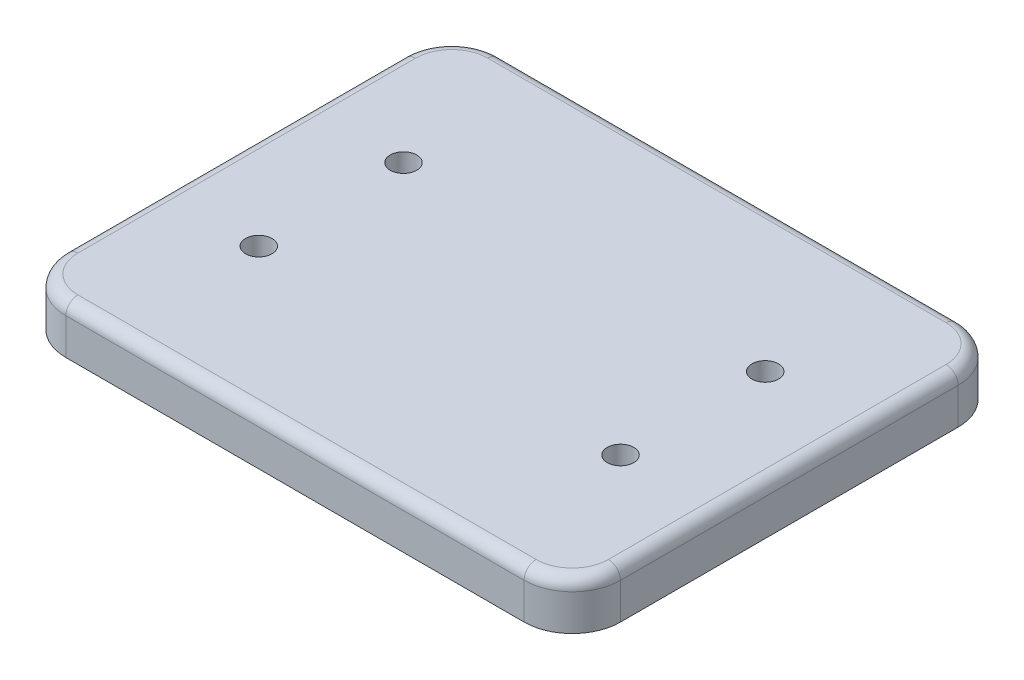
ISO-10303-21;
HEADER;
FILE_DESCRIPTION(('STEP AP214'),'2;1');
FILE_NAME('part.step','',(''),(''),'','','');
FILE_SCHEMA(('AUTOMOTIVE_DESIGN { 1 0 10303 214 1 1 1 1 }'));
ENDSEC;
DATA;
#1=APPLICATION_CONTEXT('core data for automotive mechanical design processes');
#2=APPLICATION_PROTOCOL_DEFINITION('international standard','automotive_design',2000,#1);
#3=PRODUCT_CONTEXT('',#1,'mechanical');
#4=PRODUCT('Part','Part','',(#3));
#5=PRODUCT_RELATED_PRODUCT_CATEGORY('part','',(#4));
#6=PRODUCT_DEFINITION_FORMATION('','',#4);
#7=PRODUCT_DEFINITION_CONTEXT('part definition',#1,'design');
#8=PRODUCT_DEFINITION('design','',#6,#7);
#9=PRODUCT_DEFINITION_SHAPE('','',#8);
#10=(LENGTH_UNIT() NAMED_UNIT(*) SI_UNIT(.MILLI.,.METRE.));
#11=(NAMED_UNIT(*) PLANE_ANGLE_UNIT() SI_UNIT($,.RADIAN.));
#12=(NAMED_UNIT(*) SI_UNIT($,.STERADIAN.) SOLID_ANGLE_UNIT());
#13=UNCERTAINTY_MEASURE_WITH_UNIT(LENGTH_MEASURE(1.E-05),#10,'distance_accuracy_value','');
#14=(GEOMETRIC_REPRESENTATION_CONTEXT(3) GLOBAL_UNCERTAINTY_ASSIGNED_CONTEXT((#13)) GLOBAL_UNIT_ASSIGNED_CONTEXT((#10,
#11,#12)) REPRESENTATION_CONTEXT('',''));
#15=CARTESIAN_POINT('',(0.,0.,0.));
#16=DIRECTION('',(0.,0.,1.));
#17=DIRECTION('',(1.,0.,0.));
#18=AXIS2_PLACEMENT_3D('',#15,#16,#17);
#19=CARTESIAN_POINT('',(75.,0.,30.));
#20=DIRECTION('',(0.,1.,0.));
#21=DIRECTION('',(0.,0.,1.));
#22=AXIS2_PLACEMENT_3D('',#19,#20,#21);
#23=CYLINDRICAL_SURFACE('',#22,5.5);
#24=CARTESIAN_POINT('',(75.,20.,30.));
#25=DIRECTION('',(0.,-1.,0.));
#26=DIRECTION('',(0.,0.,-1.));
#27=AXIS2_PLACEMENT_3D('',#24,#25,#26);
#28=CIRCLE('',#27,5.5);
#29=CARTESIAN_POINT('',(75.,20.,24.5));
#30=VERTEX_POINT('',#29);
#31=EDGE_CURVE('E298',#30,#30,#28,.T.);
#32=ORIENTED_EDGE('',*,*,#31,.F.);
#33=EDGE_LOOP('',(#32));
#34=FACE_BOUND('',#33,.T.);
#35=CARTESIAN_POINT('',(75.,11.,30.));
#36=DIRECTION('',(0.,-1.,0.));
#37=DIRECTION('',(0.,0.,-1.));
#38=AXIS2_PLACEMENT_3D('',#35,#36,#37);
#39=CIRCLE('',#38,5.5);
#40=CARTESIAN_POINT('',(75.,11.,24.5));
#41=VERTEX_POINT('',#40);
#42=EDGE_CURVE('E49',#41,#41,#39,.T.);
#43=ORIENTED_EDGE('',*,*,#42,.T.);
#44=EDGE_LOOP('',(#43));
#45=FACE_BOUND('',#44,.T.);
#46=ADVANCED_FACE('F45',(#34,#45),#23,.F.);
#47=CARTESIAN_POINT('',(-75.,0.,30.));
#48=DIRECTION('',(0.,1.,0.));
#49=DIRECTION('',(0.,0.,1.));
#50=AXIS2_PLACEMENT_3D('',#47,#48,#49);
#51=CYLINDRICAL_SURFACE('',#50,5.5);
#52=CARTESIAN_POINT('',(-75.,20.,30.));
#53=DIRECTION('',(0.,-1.,0.));
#54=DIRECTION('',(0.,0.,-1.));
#55=AXIS2_PLACEMENT_3D('',#52,#53,#54);
#56=CIRCLE('',#55,5.5);
#57=CARTESIAN_POINT('',(-75.,20.,24.5));
#58=VERTEX_POINT('',#57);
#59=EDGE_CURVE('E316',#58,#58,#56,.T.);
#60=ORIENTED_EDGE('',*,*,#59,.F.);
#61=EDGE_LOOP('',(#60));
#62=FACE_BOUND('',#61,.T.);
#63=CARTESIAN_POINT('',(-75.,11.,30.));
#64=DIRECTION('',(0.,-1.,0.));
#65=DIRECTION('',(0.,0.,-1.));
#66=AXIS2_PLACEMENT_3D('',#63,#64,#65);
#67=CIRCLE('',#66,5.5);
#68=CARTESIAN_POINT('',(-75.,11.,24.5));
#69=VERTEX_POINT('',#68);
#70=EDGE_CURVE('E289',#69,#69,#67,.T.);
#71=ORIENTED_EDGE('',*,*,#70,.T.);
#72=EDGE_LOOP('',(#71));
#73=FACE_BOUND('',#72,.T.);
#74=ADVANCED_FACE('F413',(#62,#73),#51,.F.);
#75=CARTESIAN_POINT('',(75.,0.,-30.));
#76=DIRECTION('',(0.,1.,0.));
#77=DIRECTION('',(0.,0.,1.));
#78=AXIS2_PLACEMENT_3D('',#75,#76,#77);
#79=CYLINDRICAL_SURFACE('',#78,5.5);
#80=CARTESIAN_POINT('',(75.,20.,-30.));
#81=DIRECTION('',(0.,1.,0.));
#82=DIRECTION('',(0.,0.,1.));
#83=AXIS2_PLACEMENT_3D('',#80,#81,#82);
#84=CIRCLE('',#83,5.5);
#85=CARTESIAN_POINT('',(75.,20.,-24.5));
#86=VERTEX_POINT('',#85);
#87=EDGE_CURVE('E168',#86,#86,#84,.T.);
#88=ORIENTED_EDGE('',*,*,#87,.T.);
#89=EDGE_LOOP('',(#88));
#90=FACE_BOUND('',#89,.T.);
#91=CARTESIAN_POINT('',(75.,11.,-30.));
#92=DIRECTION('',(0.,-1.,0.));
#93=DIRECTION('',(0.,0.,-1.));
#94=AXIS2_PLACEMENT_3D('',#91,#92,#93);
#95=CIRCLE('',#94,5.5);
#96=CARTESIAN_POINT('',(75.,11.,-35.5));
#97=VERTEX_POINT('',#96);
#98=EDGE_CURVE('E285',#97,#97,#95,.F.);
#99=ORIENTED_EDGE('',*,*,#98,.F.);
#100=EDGE_LOOP('',(#99));
#101=FACE_BOUND('',#100,.T.);
#102=ADVANCED_FACE('F345',(#90,#101),#79,.F.);
#103=CARTESIAN_POINT('',(-75.,0.,-30.));
#104=DIRECTION('',(0.,1.,0.));
#105=DIRECTION('',(0.,0.,1.));
#106=AXIS2_PLACEMENT_3D('',#103,#104,#105);
#107=CYLINDRICAL_SURFACE('',#106,5.5);
#108=CARTESIAN_POINT('',(-75.,20.,-30.));
#109=DIRECTION('',(0.,1.,0.));
#110=DIRECTION('',(0.,0.,1.));
#111=AXIS2_PLACEMENT_3D('',#108,#109,#110);
#112=CIRCLE('',#111,5.5);
#113=CARTESIAN_POINT('',(-75.,20.,-24.5));
#114=VERTEX_POINT('',#113);
#115=EDGE_CURVE('E259',#114,#114,#112,.T.);
#116=ORIENTED_EDGE('',*,*,#115,.T.);
#117=EDGE_LOOP('',(#116));
#118=FACE_BOUND('',#117,.T.);
#119=CARTESIAN_POINT('',(-75.,11.,-30.));
#120=DIRECTION('',(0.,-1.,0.));
#121=DIRECTION('',(0.,0.,-1.));
#122=AXIS2_PLACEMENT_3D('',#119,#120,#121);
#123=CIRCLE('',#122,5.5);
#124=CARTESIAN_POINT('',(-75.,11.,-35.5));
#125=VERTEX_POINT('',#124);
#126=EDGE_CURVE('E281',#125,#125,#123,.F.);
#127=ORIENTED_EDGE('',*,*,#126,.F.);
#128=EDGE_LOOP('',(#127));
#129=FACE_BOUND('',#128,.T.);
#130=ADVANCED_FACE('F442',(#118,#129),#107,.F.);
#131=CARTESIAN_POINT('',(-95.,20.,-70.));
#132=DIRECTION('',(0.,-1.,0.));
#133=DIRECTION('',(0.,0.,-1.));
#134=AXIS2_PLACEMENT_3D('',#131,#132,#133);
#135=CYLINDRICAL_SURFACE('',#134,20.);
#136=DIRECTION('',(0.,-1.,0.));
#137=VECTOR('',#136,1.);
#138=CARTESIAN_POINT('',(-115.,20.,-69.9999999999999));
#139=LINE('',#138,#137);
#140=CARTESIAN_POINT('',(-115.,15.,-69.9999999999999));
#141=VERTEX_POINT('',#140);
#142=CARTESIAN_POINT('',(-115.,0.,-69.9999999999999));
#143=VERTEX_POINT('',#142);
#144=EDGE_CURVE('E134',#141,#143,#139,.T.);
#145=ORIENTED_EDGE('',*,*,#144,.F.);
#146=CARTESIAN_POINT('',(-95.,15.,-70.));
#147=DIRECTION('',(0.,1.,0.));
#148=DIRECTION('',(0.,0.,1.));
#149=AXIS2_PLACEMENT_3D('',#146,#147,#148);
#150=CIRCLE('',#149,20.);
#151=CARTESIAN_POINT('',(-94.9999999999998,15.,-90.));
#152=VERTEX_POINT('',#151);
#153=EDGE_CURVE('E11',#141,#152,#150,.F.);
#154=ORIENTED_EDGE('',*,*,#153,.T.);
#155=DIRECTION('',(0.,-1.,0.));
#156=VECTOR('',#155,1.);
#157=CARTESIAN_POINT('',(-94.9999999999998,20.,-90.));
#158=LINE('',#157,#156);
#159=CARTESIAN_POINT('',(-94.9999999999998,0.,-90.));
#160=VERTEX_POINT('',#159);
#161=EDGE_CURVE('E158',#152,#160,#158,.T.);
#162=ORIENTED_EDGE('',*,*,#161,.T.);
#163=CARTESIAN_POINT('',(-95.,0.,-70.));
#164=DIRECTION('',(0.,1.,0.));
#165=DIRECTION('',(0.,0.,1.));
#166=AXIS2_PLACEMENT_3D('',#163,#164,#165);
#167=CIRCLE('',#166,20.);
#168=EDGE_CURVE('E150',#160,#143,#167,.T.);
#169=ORIENTED_EDGE('',*,*,#168,.T.);
#170=EDGE_LOOP('',(#145,#154,#162,#169));
#171=FACE_BOUND('',#170,.T.);
#172=ADVANCED_FACE('F156',(#171),#135,.T.);
#173=CARTESIAN_POINT('',(-115.,20.,-69.9999999999999));
#174=DIRECTION('',(1.,0.,0.));
#175=DIRECTION('',(0.,0.,-1.));
#176=AXIS2_PLACEMENT_3D('',#173,#174,#175);
#177=PLANE('',#176);
#178=DIRECTION('',(0.,-1.,0.));
#179=VECTOR('',#178,1.);
#180=CARTESIAN_POINT('',(-115.,20.,69.9999999999998));
#181=LINE('',#180,#179);
#182=CARTESIAN_POINT('',(-115.,15.,69.9999999999998));
#183=VERTEX_POINT('',#182);
#184=CARTESIAN_POINT('',(-115.,0.,69.9999999999998));
#185=VERTEX_POINT('',#184);
#186=EDGE_CURVE('E144',#183,#185,#181,.T.);
#187=ORIENTED_EDGE('',*,*,#186,.F.);
#188=DIRECTION('',(0.,0.,1.));
#189=VECTOR('',#188,1.);
#190=CARTESIAN_POINT('',(-115.,15.,-69.9999999999999));
#191=LINE('',#190,#189);
#192=EDGE_CURVE('E55',#183,#141,#191,.F.);
#193=ORIENTED_EDGE('',*,*,#192,.T.);
#194=ORIENTED_EDGE('',*,*,#144,.T.);
#195=DIRECTION('',(0.,0.,1.));
#196=VECTOR('',#195,1.);
#197=CARTESIAN_POINT('',(-115.,0.,-69.9999999999999));
#198=LINE('',#197,#196);
#199=EDGE_CURVE('E137',#143,#185,#198,.T.);
#200=ORIENTED_EDGE('',*,*,#199,.T.);
#201=EDGE_LOOP('',(#187,#193,#194,#200));
#202=FACE_BOUND('',#201,.T.);
#203=ADVANCED_FACE('F136',(#202),#177,.F.);
#204=CARTESIAN_POINT('',(-95.,20.,70.));
#205=DIRECTION('',(0.,-1.,0.));
#206=DIRECTION('',(0.,0.,-1.));
#207=AXIS2_PLACEMENT_3D('',#204,#205,#206);
#208=CYLINDRICAL_SURFACE('',#207,20.);
#209=DIRECTION('',(0.,-1.,0.));
#210=VECTOR('',#209,1.);
#211=CARTESIAN_POINT('',(-94.9999999999998,20.,90.));
#212=LINE('',#211,#210);
#213=CARTESIAN_POINT('',(-94.9999999999998,15.,90.));
#214=VERTEX_POINT('',#213);
#215=CARTESIAN_POINT('',(-94.9999999999998,0.,90.));
#216=VERTEX_POINT('',#215);
#217=EDGE_CURVE('E206',#214,#216,#212,.T.);
#218=ORIENTED_EDGE('',*,*,#217,.F.);
#219=CARTESIAN_POINT('',(-95.,15.,70.));
#220=DIRECTION('',(0.,1.,0.));
#221=DIRECTION('',(0.,0.,1.));
#222=AXIS2_PLACEMENT_3D('',#219,#220,#221);
#223=CIRCLE('',#222,20.);
#224=EDGE_CURVE('E70',#214,#183,#223,.F.);
#225=ORIENTED_EDGE('',*,*,#224,.T.);
#226=ORIENTED_EDGE('',*,*,#186,.T.);
#227=CARTESIAN_POINT('',(-95.,0.,70.));
#228=DIRECTION('',(0.,1.,0.));
#229=DIRECTION('',(0.,0.,-1.));
#230=AXIS2_PLACEMENT_3D('',#227,#228,#229);
#231=CIRCLE('',#230,20.);
#232=EDGE_CURVE('E153',#185,#216,#231,.T.);
#233=ORIENTED_EDGE('',*,*,#232,.T.);
#234=EDGE_LOOP('',(#218,#225,#226,#233));
#235=FACE_BOUND('',#234,.T.);
#236=ADVANCED_FACE('F663',(#235),#208,.T.);
#237=CARTESIAN_POINT('',(94.9999999999999,20.,90.));
#238=DIRECTION('',(0.,0.,-1.));
#239=DIRECTION('',(-1.,0.,0.));
#240=AXIS2_PLACEMENT_3D('',#237,#238,#239);
#241=PLANE('',#240);
#242=DIRECTION('',(0.,-1.,0.));
#243=VECTOR('',#242,1.);
#244=CARTESIAN_POINT('',(94.9999999999999,20.,90.));
#245=LINE('',#244,#243);
#246=CARTESIAN_POINT('',(94.9999999999999,15.,90.));
#247=VERTEX_POINT('',#246);
#248=CARTESIAN_POINT('',(94.9999999999999,0.,90.));
#249=VERTEX_POINT('',#248);
#250=EDGE_CURVE('E203',#247,#249,#245,.T.);
#251=ORIENTED_EDGE('',*,*,#250,.F.);
#252=DIRECTION('',(1.,0.,0.));
#253=VECTOR('',#252,1.);
#254=CARTESIAN_POINT('',(-94.9999999999998,15.,90.));
#255=LINE('',#254,#253);
#256=EDGE_CURVE('E248',#247,#214,#255,.F.);
#257=ORIENTED_EDGE('',*,*,#256,.T.);
#258=ORIENTED_EDGE('',*,*,#217,.T.);
#259=DIRECTION('',(1.,0.,0.));
#260=VECTOR('',#259,1.);
#261=CARTESIAN_POINT('',(94.9999999999999,0.,90.));
#262=LINE('',#261,#260);
#263=EDGE_CURVE('E173',#216,#249,#262,.T.);
#264=ORIENTED_EDGE('',*,*,#263,.T.);
#265=EDGE_LOOP('',(#251,#257,#258,#264));
#266=FACE_BOUND('',#265,.T.);
#267=ADVANCED_FACE('F654',(#266),#241,.F.);
#268=CARTESIAN_POINT('',(95.,20.,70.));
#269=DIRECTION('',(0.,-1.,0.));
#270=DIRECTION('',(0.,0.,-1.));
#271=AXIS2_PLACEMENT_3D('',#268,#269,#270);
#272=CYLINDRICAL_SURFACE('',#271,20.);
#273=DIRECTION('',(0.,-1.,0.));
#274=VECTOR('',#273,1.);
#275=CARTESIAN_POINT('',(115.,20.,69.9999999999998));
#276=LINE('',#275,#274);
#277=CARTESIAN_POINT('',(115.,15.,69.9999999999998));
#278=VERTEX_POINT('',#277);
#279=CARTESIAN_POINT('',(115.,0.,69.9999999999998));
#280=VERTEX_POINT('',#279);
#281=EDGE_CURVE('E200',#278,#280,#276,.T.);
#282=ORIENTED_EDGE('',*,*,#281,.F.);
#283=CARTESIAN_POINT('',(95.,15.,70.));
#284=DIRECTION('',(0.,1.,0.));
#285=DIRECTION('',(0.,0.,1.));
#286=AXIS2_PLACEMENT_3D('',#283,#284,#285);
#287=CIRCLE('',#286,20.);
#288=EDGE_CURVE('E245',#278,#247,#287,.F.);
#289=ORIENTED_EDGE('',*,*,#288,.T.);
#290=ORIENTED_EDGE('',*,*,#250,.T.);
#291=CARTESIAN_POINT('',(95.,0.,70.));
#292=DIRECTION('',(0.,1.,0.));
#293=DIRECTION('',(0.,0.,-1.));
#294=AXIS2_PLACEMENT_3D('',#291,#292,#293);
#295=CIRCLE('',#294,20.);
#296=EDGE_CURVE('E177',#249,#280,#295,.T.);
#297=ORIENTED_EDGE('',*,*,#296,.T.);
#298=EDGE_LOOP('',(#282,#289,#290,#297));
#299=FACE_BOUND('',#298,.T.);
#300=ADVANCED_FACE('F395',(#299),#272,.T.);
#301=CARTESIAN_POINT('',(115.,20.,-69.9999999999999));
#302=DIRECTION('',(-1.,0.,0.));
#303=DIRECTION('',(0.,0.,1.));
#304=AXIS2_PLACEMENT_3D('',#301,#302,#303);
#305=PLANE('',#304);
#306=DIRECTION('',(0.,-1.,0.));
#307=VECTOR('',#306,1.);
#308=CARTESIAN_POINT('',(115.,20.,-69.9999999999999));
#309=LINE('',#308,#307);
#310=CARTESIAN_POINT('',(115.,15.,-69.9999999999999));
#311=VERTEX_POINT('',#310);
#312=CARTESIAN_POINT('',(115.,0.,-69.9999999999999));
#313=VERTEX_POINT('',#312);
#314=EDGE_CURVE('E197',#311,#313,#309,.T.);
#315=ORIENTED_EDGE('',*,*,#314,.F.);
#316=DIRECTION('',(0.,0.,-1.));
#317=VECTOR('',#316,1.);
#318=CARTESIAN_POINT('',(115.,15.,69.9999999999998));
#319=LINE('',#318,#317);
#320=EDGE_CURVE('E242',#311,#278,#319,.F.);
#321=ORIENTED_EDGE('',*,*,#320,.T.);
#322=ORIENTED_EDGE('',*,*,#281,.T.);
#323=DIRECTION('',(0.,0.,-1.));
#324=VECTOR('',#323,1.);
#325=CARTESIAN_POINT('',(115.,0.,-69.9999999999999));
#326=LINE('',#325,#324);
#327=EDGE_CURVE('E181',#280,#313,#326,.T.);
#328=ORIENTED_EDGE('',*,*,#327,.T.);
#329=EDGE_LOOP('',(#315,#321,#322,#328));
#330=FACE_BOUND('',#329,.T.);
#331=ADVANCED_FACE('F393',(#330),#305,.F.);
#332=CARTESIAN_POINT('',(95.,20.,-70.));
#333=DIRECTION('',(0.,-1.,0.));
#334=DIRECTION('',(0.,0.,-1.));
#335=AXIS2_PLACEMENT_3D('',#332,#333,#334);
#336=CYLINDRICAL_SURFACE('',#335,20.);
#337=DIRECTION('',(0.,-1.,0.));
#338=VECTOR('',#337,1.);
#339=CARTESIAN_POINT('',(94.9999999999999,20.,-90.));
#340=LINE('',#339,#338);
#341=CARTESIAN_POINT('',(94.9999999999999,15.,-90.));
#342=VERTEX_POINT('',#341);
#343=CARTESIAN_POINT('',(94.9999999999999,0.,-90.));
#344=VERTEX_POINT('',#343);
#345=EDGE_CURVE('E194',#342,#344,#340,.T.);
#346=ORIENTED_EDGE('',*,*,#345,.F.);
#347=CARTESIAN_POINT('',(95.,15.,-70.));
#348=DIRECTION('',(0.,1.,0.));
#349=DIRECTION('',(0.,0.,1.));
#350=AXIS2_PLACEMENT_3D('',#347,#348,#349);
#351=CIRCLE('',#350,20.);
#352=EDGE_CURVE('E239',#342,#311,#351,.F.);
#353=ORIENTED_EDGE('',*,*,#352,.T.);
#354=ORIENTED_EDGE('',*,*,#314,.T.);
#355=CARTESIAN_POINT('',(95.,0.,-70.));
#356=DIRECTION('',(0.,1.,0.));
#357=DIRECTION('',(0.,0.,-1.));
#358=AXIS2_PLACEMENT_3D('',#355,#356,#357);
#359=CIRCLE('',#358,20.);
#360=EDGE_CURVE('E185',#313,#344,#359,.T.);
#361=ORIENTED_EDGE('',*,*,#360,.T.);
#362=EDGE_LOOP('',(#346,#353,#354,#361));
#363=FACE_BOUND('',#362,.T.);
#364=ADVANCED_FACE('F402',(#363),#336,.T.);
#365=CARTESIAN_POINT('',(94.9999999999999,20.,-90.));
#366=DIRECTION('',(0.,0.,1.));
#367=DIRECTION('',(1.,0.,0.));
#368=AXIS2_PLACEMENT_3D('',#365,#366,#367);
#369=PLANE('',#368);
#370=ORIENTED_EDGE('',*,*,#161,.F.);
#371=DIRECTION('',(-1.,0.,0.));
#372=VECTOR('',#371,1.);
#373=CARTESIAN_POINT('',(94.9999999999999,15.,-90.));
#374=LINE('',#373,#372);
#375=EDGE_CURVE('E235',#152,#342,#374,.F.);
#376=ORIENTED_EDGE('',*,*,#375,.T.);
#377=ORIENTED_EDGE('',*,*,#345,.T.);
#378=DIRECTION('',(-1.,0.,0.));
#379=VECTOR('',#378,1.);
#380=CARTESIAN_POINT('',(94.9999999999999,0.,-90.));
#381=LINE('',#380,#379);
#382=EDGE_CURVE('E189',#344,#160,#381,.T.);
#383=ORIENTED_EDGE('',*,*,#382,.T.);
#384=EDGE_LOOP('',(#370,#376,#377,#383));
#385=FACE_BOUND('',#384,.T.);
#386=ADVANCED_FACE('F351',(#385),#369,.F.);
#387=CARTESIAN_POINT('',(-95.,20.,-70.));
#388=DIRECTION('',(0.,1.,0.));
#389=DIRECTION('',(0.,0.,1.));
#390=AXIS2_PLACEMENT_3D('',#387,#388,#389);
#391=PLANE('',#390);
#392=ORIENTED_EDGE('',*,*,#59,.T.);
#393=EDGE_LOOP('',(#392));
#394=FACE_BOUND('',#393,.T.);
#395=ORIENTED_EDGE('',*,*,#31,.T.);
#396=EDGE_LOOP('',(#395));
#397=FACE_BOUND('',#396,.T.);
#398=ORIENTED_EDGE('',*,*,#115,.F.);
#399=EDGE_LOOP('',(#398));
#400=FACE_BOUND('',#399,.T.);
#401=ORIENTED_EDGE('',*,*,#87,.F.);
#402=EDGE_LOOP('',(#401));
#403=FACE_BOUND('',#402,.T.);
#404=CARTESIAN_POINT('',(95.,20.,-70.));
#405=DIRECTION('',(0.,1.,0.));
#406=DIRECTION('',(0.,0.,1.));
#407=AXIS2_PLACEMENT_3D('',#404,#405,#406);
#408=CIRCLE('',#407,15.);
#409=CARTESIAN_POINT('',(110.,20.,-69.9999999999999));
#410=VERTEX_POINT('',#409);
#411=CARTESIAN_POINT('',(94.9999999999999,20.,-85.));
#412=VERTEX_POINT('',#411);
#413=EDGE_CURVE('E228',#410,#412,#408,.T.);
#414=ORIENTED_EDGE('',*,*,#413,.T.);
#415=DIRECTION('',(-1.,0.,0.));
#416=VECTOR('',#415,1.);
#417=CARTESIAN_POINT('',(-94.9999999999998,20.,-85.));
#418=LINE('',#417,#416);
#419=CARTESIAN_POINT('',(-94.9999999999998,20.,-85.));
#420=VERTEX_POINT('',#419);
#421=EDGE_CURVE('E231',#412,#420,#418,.T.);
#422=ORIENTED_EDGE('',*,*,#421,.T.);
#423=CARTESIAN_POINT('',(-95.,20.,-70.));
#424=DIRECTION('',(0.,1.,0.));
#425=DIRECTION('',(0.,0.,1.));
#426=AXIS2_PLACEMENT_3D('',#423,#424,#425);
#427=CIRCLE('',#426,15.);
#428=CARTESIAN_POINT('',(-110.,20.,-69.9999999999999));
#429=VERTEX_POINT('',#428);
#430=EDGE_CURVE('E143',#420,#429,#427,.T.);
#431=ORIENTED_EDGE('',*,*,#430,.T.);
#432=DIRECTION('',(0.,0.,1.));
#433=VECTOR('',#432,1.);
#434=CARTESIAN_POINT('',(-110.,20.,69.9999999999998));
#435=LINE('',#434,#433);
#436=CARTESIAN_POINT('',(-110.,20.,69.9999999999999));
#437=VERTEX_POINT('',#436);
#438=EDGE_CURVE('E213',#429,#437,#435,.T.);
#439=ORIENTED_EDGE('',*,*,#438,.T.);
#440=CARTESIAN_POINT('',(-95.,20.,70.));
#441=DIRECTION('',(0.,1.,0.));
#442=DIRECTION('',(0.,0.,1.));
#443=AXIS2_PLACEMENT_3D('',#440,#441,#442);
#444=CIRCLE('',#443,15.);
#445=CARTESIAN_POINT('',(-94.9999999999998,20.,85.));
#446=VERTEX_POINT('',#445);
#447=EDGE_CURVE('E216',#437,#446,#444,.T.);
#448=ORIENTED_EDGE('',*,*,#447,.T.);
#449=DIRECTION('',(1.,0.,0.));
#450=VECTOR('',#449,1.);
#451=CARTESIAN_POINT('',(94.9999999999999,20.,85.));
#452=LINE('',#451,#450);
#453=CARTESIAN_POINT('',(94.9999999999999,20.,85.));
#454=VERTEX_POINT('',#453);
#455=EDGE_CURVE('E219',#446,#454,#452,.T.);
#456=ORIENTED_EDGE('',*,*,#455,.T.);
#457=CARTESIAN_POINT('',(95.,20.,70.));
#458=DIRECTION('',(0.,1.,0.));
#459=DIRECTION('',(0.,0.,1.));
#460=AXIS2_PLACEMENT_3D('',#457,#458,#459);
#461=CIRCLE('',#460,15.);
#462=CARTESIAN_POINT('',(110.,20.,69.9999999999998));
#463=VERTEX_POINT('',#462);
#464=EDGE_CURVE('E222',#454,#463,#461,.T.);
#465=ORIENTED_EDGE('',*,*,#464,.T.);
#466=DIRECTION('',(0.,0.,-1.));
#467=VECTOR('',#466,1.);
#468=CARTESIAN_POINT('',(110.,20.,-69.9999999999999));
#469=LINE('',#468,#467);
#470=EDGE_CURVE('E225',#463,#410,#469,.T.);
#471=ORIENTED_EDGE('',*,*,#470,.T.);
#472=EDGE_LOOP('',(#414,#422,#431,#439,#448,#456,#465,#471));
#473=FACE_BOUND('',#472,.T.);
#474=ADVANCED_FACE('F348',(#394,#397,#400,#403,#473),#391,.T.);
#475=CARTESIAN_POINT('',(-95.,0.,-70.));
#476=DIRECTION('',(0.,1.,0.));
#477=DIRECTION('',(0.,0.,1.));
#478=AXIS2_PLACEMENT_3D('',#475,#476,#477);
#479=PLANE('',#478);
#480=CARTESIAN_POINT('',(-75.,0.,30.));
#481=DIRECTION('',(0.,1.,0.));
#482=DIRECTION('',(0.,0.,1.));
#483=AXIS2_PLACEMENT_3D('',#480,#481,#482);
#484=CIRCLE('',#483,9.);
#485=CARTESIAN_POINT('',(-75.,0.,39.));
#486=VERTEX_POINT('',#485);
#487=EDGE_CURVE('E300',#486,#486,#484,.T.);
#488=ORIENTED_EDGE('',*,*,#487,.T.);
#489=EDGE_LOOP('',(#488));
#490=FACE_BOUND('',#489,.T.);
#491=CARTESIAN_POINT('',(75.,0.,30.));
#492=DIRECTION('',(0.,1.,0.));
#493=DIRECTION('',(0.,0.,1.));
#494=AXIS2_PLACEMENT_3D('',#491,#492,#493);
#495=CIRCLE('',#494,9.);
#496=CARTESIAN_POINT('',(75.,0.,39.));
#497=VERTEX_POINT('',#496);
#498=EDGE_CURVE('E312',#497,#497,#495,.T.);
#499=ORIENTED_EDGE('',*,*,#498,.T.);
#500=EDGE_LOOP('',(#499));
#501=FACE_BOUND('',#500,.T.);
#502=CARTESIAN_POINT('',(-75.,0.,-30.));
#503=DIRECTION('',(0.,-1.,0.));
#504=DIRECTION('',(0.,0.,-1.));
#505=AXIS2_PLACEMENT_3D('',#502,#503,#504);
#506=CIRCLE('',#505,9.);
#507=CARTESIAN_POINT('',(-75.,0.,-39.));
#508=VERTEX_POINT('',#507);
#509=EDGE_CURVE('E327',#508,#508,#506,.T.);
#510=ORIENTED_EDGE('',*,*,#509,.F.);
#511=EDGE_LOOP('',(#510));
#512=FACE_BOUND('',#511,.T.);
#513=CARTESIAN_POINT('',(75.,0.,-30.));
#514=DIRECTION('',(0.,-1.,0.));
#515=DIRECTION('',(0.,0.,-1.));
#516=AXIS2_PLACEMENT_3D('',#513,#514,#515);
#517=CIRCLE('',#516,9.);
#518=CARTESIAN_POINT('',(75.,0.,-39.));
#519=VERTEX_POINT('',#518);
#520=EDGE_CURVE('E331',#519,#519,#517,.T.);
#521=ORIENTED_EDGE('',*,*,#520,.F.);
#522=EDGE_LOOP('',(#521));
#523=FACE_BOUND('',#522,.T.);
#524=ORIENTED_EDGE('',*,*,#168,.F.);
#525=ORIENTED_EDGE('',*,*,#382,.F.);
#526=ORIENTED_EDGE('',*,*,#360,.F.);
#527=ORIENTED_EDGE('',*,*,#327,.F.);
#528=ORIENTED_EDGE('',*,*,#296,.F.);
#529=ORIENTED_EDGE('',*,*,#263,.F.);
#530=ORIENTED_EDGE('',*,*,#232,.F.);
#531=ORIENTED_EDGE('',*,*,#199,.F.);
#532=EDGE_LOOP('',(#524,#525,#526,#527,#528,#529,#530,#531));
#533=FACE_BOUND('',#532,.T.);
#534=ADVANCED_FACE('F148',(#490,#501,#512,#523,#533),#479,.F.);
#535=CARTESIAN_POINT('',(-95.,15.,85.));
#536=DIRECTION('',(-1.,0.,0.));
#537=DIRECTION('',(0.,0.,1.));
#538=AXIS2_PLACEMENT_3D('',#535,#536,#537);
#539=CYLINDRICAL_SURFACE('',#538,5.);
#540=CARTESIAN_POINT('',(-94.9999999999998,15.,85.));
#541=DIRECTION('',(-1.,0.,0.));
#542=DIRECTION('',(0.,0.,1.));
#543=AXIS2_PLACEMENT_3D('',#540,#541,#542);
#544=CIRCLE('',#543,5.);
#545=EDGE_CURVE('E165',#214,#446,#544,.T.);
#546=ORIENTED_EDGE('',*,*,#545,.F.);
#547=ORIENTED_EDGE('',*,*,#256,.F.);
#548=CARTESIAN_POINT('',(94.9999999999999,15.,85.));
#549=DIRECTION('',(1.,0.,0.));
#550=DIRECTION('',(0.,0.,-1.));
#551=AXIS2_PLACEMENT_3D('',#548,#549,#550);
#552=CIRCLE('',#551,5.);
#553=EDGE_CURVE('E161',#454,#247,#552,.T.);
#554=ORIENTED_EDGE('',*,*,#553,.F.);
#555=ORIENTED_EDGE('',*,*,#455,.F.);
#556=EDGE_LOOP('',(#546,#547,#554,#555));
#557=FACE_BOUND('',#556,.T.);
#558=ADVANCED_FACE('F47',(#557),#539,.T.);
#559=CARTESIAN_POINT('',(95.,15.,70.));
#560=DIRECTION('',(0.,1.,0.));
#561=DIRECTION('',(0.,0.,1.));
#562=AXIS2_PLACEMENT_3D('',#559,#560,#561);
#563=TOROIDAL_SURFACE('',#562,15.,5.);
#564=ORIENTED_EDGE('',*,*,#553,.T.);
#565=ORIENTED_EDGE('',*,*,#288,.F.);
#566=CARTESIAN_POINT('',(110.,15.,69.9999999999998));
#567=DIRECTION('',(0.,0.,-1.));
#568=DIRECTION('',(-1.,0.,0.));
#569=AXIS2_PLACEMENT_3D('',#566,#567,#568);
#570=CIRCLE('',#569,5.);
#571=EDGE_CURVE('E274',#463,#278,#570,.T.);
#572=ORIENTED_EDGE('',*,*,#571,.F.);
#573=ORIENTED_EDGE('',*,*,#464,.F.);
#574=EDGE_LOOP('',(#564,#565,#572,#573));
#575=FACE_BOUND('',#574,.T.);
#576=ADVANCED_FACE('F386',(#575),#563,.T.);
#577=CARTESIAN_POINT('',(-95.,15.,70.));
#578=DIRECTION('',(0.,1.,0.));
#579=DIRECTION('',(0.,0.,1.));
#580=AXIS2_PLACEMENT_3D('',#577,#578,#579);
#581=TOROIDAL_SURFACE('',#580,15.,5.);
#582=ORIENTED_EDGE('',*,*,#545,.T.);
#583=ORIENTED_EDGE('',*,*,#447,.F.);
#584=CARTESIAN_POINT('',(-110.,15.,69.9999999999999));
#585=DIRECTION('',(0.,0.,-1.));
#586=DIRECTION('',(-1.,0.,0.));
#587=AXIS2_PLACEMENT_3D('',#584,#585,#586);
#588=CIRCLE('',#587,5.);
#589=EDGE_CURVE('E270',#183,#437,#588,.T.);
#590=ORIENTED_EDGE('',*,*,#589,.F.);
#591=ORIENTED_EDGE('',*,*,#224,.F.);
#592=EDGE_LOOP('',(#582,#583,#590,#591));
#593=FACE_BOUND('',#592,.T.);
#594=ADVANCED_FACE('F376',(#593),#581,.T.);
#595=CARTESIAN_POINT('',(110.,15.,-70.0000000000001));
#596=DIRECTION('',(0.,0.,1.));
#597=DIRECTION('',(1.,0.,0.));
#598=AXIS2_PLACEMENT_3D('',#595,#596,#597);
#599=CYLINDRICAL_SURFACE('',#598,5.);
#600=ORIENTED_EDGE('',*,*,#571,.T.);
#601=ORIENTED_EDGE('',*,*,#320,.F.);
#602=CARTESIAN_POINT('',(110.,15.,-69.9999999999999));
#603=DIRECTION('',(0.,0.,-1.));
#604=DIRECTION('',(-1.,0.,0.));
#605=AXIS2_PLACEMENT_3D('',#602,#603,#604);
#606=CIRCLE('',#605,5.);
#607=EDGE_CURVE('E266',#410,#311,#606,.T.);
#608=ORIENTED_EDGE('',*,*,#607,.F.);
#609=ORIENTED_EDGE('',*,*,#470,.F.);
#610=EDGE_LOOP('',(#600,#601,#608,#609));
#611=FACE_BOUND('',#610,.T.);
#612=ADVANCED_FACE('F389',(#611),#599,.T.);
#613=CARTESIAN_POINT('',(-110.,15.,-70.));
#614=DIRECTION('',(0.,0.,-1.));
#615=DIRECTION('',(-1.,0.,0.));
#616=AXIS2_PLACEMENT_3D('',#613,#614,#615);
#617=CYLINDRICAL_SURFACE('',#616,5.);
#618=ORIENTED_EDGE('',*,*,#589,.T.);
#619=ORIENTED_EDGE('',*,*,#438,.F.);
#620=CARTESIAN_POINT('',(-110.,15.,-69.9999999999999));
#621=DIRECTION('',(0.,0.,-1.));
#622=DIRECTION('',(-1.,0.,0.));
#623=AXIS2_PLACEMENT_3D('',#620,#621,#622);
#624=CIRCLE('',#623,5.);
#625=EDGE_CURVE('E262',#141,#429,#624,.T.);
#626=ORIENTED_EDGE('',*,*,#625,.F.);
#627=ORIENTED_EDGE('',*,*,#192,.F.);
#628=EDGE_LOOP('',(#618,#619,#626,#627));
#629=FACE_BOUND('',#628,.T.);
#630=ADVANCED_FACE('F373',(#629),#617,.T.);
#631=CARTESIAN_POINT('',(95.,15.,-70.));
#632=DIRECTION('',(0.,1.,0.));
#633=DIRECTION('',(0.,0.,1.));
#634=AXIS2_PLACEMENT_3D('',#631,#632,#633);
#635=TOROIDAL_SURFACE('',#634,15.,5.);
#636=ORIENTED_EDGE('',*,*,#607,.T.);
#637=ORIENTED_EDGE('',*,*,#352,.F.);
#638=CARTESIAN_POINT('',(94.9999999999999,15.,-85.));
#639=DIRECTION('',(-1.,0.,0.));
#640=DIRECTION('',(0.,0.,1.));
#641=AXIS2_PLACEMENT_3D('',#638,#639,#640);
#642=CIRCLE('',#641,5.);
#643=EDGE_CURVE('E258',#412,#342,#642,.T.);
#644=ORIENTED_EDGE('',*,*,#643,.F.);
#645=ORIENTED_EDGE('',*,*,#413,.F.);
#646=EDGE_LOOP('',(#636,#637,#644,#645));
#647=FACE_BOUND('',#646,.T.);
#648=ADVANCED_FACE('F361',(#647),#635,.T.);
#649=CARTESIAN_POINT('',(-95.,15.,-70.));
#650=DIRECTION('',(0.,1.,0.));
#651=DIRECTION('',(0.,0.,1.));
#652=AXIS2_PLACEMENT_3D('',#649,#650,#651);
#653=TOROIDAL_SURFACE('',#652,15.,5.);
#654=ORIENTED_EDGE('',*,*,#625,.T.);
#655=ORIENTED_EDGE('',*,*,#430,.F.);
#656=CARTESIAN_POINT('',(-94.9999999999999,15.,-85.));
#657=DIRECTION('',(1.,0.,0.));
#658=DIRECTION('',(0.,0.,-1.));
#659=AXIS2_PLACEMENT_3D('',#656,#657,#658);
#660=CIRCLE('',#659,5.);
#661=EDGE_CURVE('E255',#152,#420,#660,.T.);
#662=ORIENTED_EDGE('',*,*,#661,.F.);
#663=ORIENTED_EDGE('',*,*,#153,.F.);
#664=EDGE_LOOP('',(#654,#655,#662,#663));
#665=FACE_BOUND('',#664,.T.);
#666=ADVANCED_FACE('F369',(#665),#653,.T.);
#667=CARTESIAN_POINT('',(-95.,15.,-85.));
#668=DIRECTION('',(1.,0.,0.));
#669=DIRECTION('',(0.,0.,-1.));
#670=AXIS2_PLACEMENT_3D('',#667,#668,#669);
#671=CYLINDRICAL_SURFACE('',#670,5.);
#672=ORIENTED_EDGE('',*,*,#643,.T.);
#673=ORIENTED_EDGE('',*,*,#375,.F.);
#674=ORIENTED_EDGE('',*,*,#661,.T.);
#675=ORIENTED_EDGE('',*,*,#421,.F.);
#676=EDGE_LOOP('',(#672,#673,#674,#675));
#677=FACE_BOUND('',#676,.T.);
#678=ADVANCED_FACE('F364',(#677),#671,.T.);
#679=CARTESIAN_POINT('',(-75.,11.,-30.));
#680=DIRECTION('',(0.,-1.,0.));
#681=DIRECTION('',(0.,0.,-1.));
#682=AXIS2_PLACEMENT_3D('',#679,#680,#681);
#683=PLANE('',#682);
#684=CARTESIAN_POINT('',(-75.,11.,-30.));
#685=DIRECTION('',(0.,-1.,0.));
#686=DIRECTION('',(0.,0.,-1.));
#687=AXIS2_PLACEMENT_3D('',#684,#685,#686);
#688=CIRCLE('',#687,9.);
#689=CARTESIAN_POINT('',(-75.,11.,-39.));
#690=VERTEX_POINT('',#689);
#691=EDGE_CURVE('E286',#690,#690,#688,.T.);
#692=ORIENTED_EDGE('',*,*,#691,.T.);
#693=EDGE_LOOP('',(#692));
#694=FACE_BOUND('',#693,.T.);
#695=ORIENTED_EDGE('',*,*,#126,.T.);
#696=EDGE_LOOP('',(#695));
#697=FACE_BOUND('',#696,.T.);
#698=ADVANCED_FACE('F426',(#694,#697),#683,.T.);
#699=CARTESIAN_POINT('',(-75.,11.,-30.));
#700=DIRECTION('',(0.,-1.,0.));
#701=DIRECTION('',(0.,0.,-1.));
#702=AXIS2_PLACEMENT_3D('',#699,#700,#701);
#703=CYLINDRICAL_SURFACE('',#702,9.);
#704=ORIENTED_EDGE('',*,*,#691,.F.);
#705=EDGE_LOOP('',(#704));
#706=FACE_BOUND('',#705,.T.);
#707=ORIENTED_EDGE('',*,*,#509,.T.);
#708=EDGE_LOOP('',(#707));
#709=FACE_BOUND('',#708,.T.);
#710=ADVANCED_FACE('F429',(#706,#709),#703,.F.);
#711=CARTESIAN_POINT('',(75.,11.,-30.));
#712=DIRECTION('',(0.,-1.,0.));
#713=DIRECTION('',(0.,0.,-1.));
#714=AXIS2_PLACEMENT_3D('',#711,#712,#713);
#715=PLANE('',#714);
#716=CARTESIAN_POINT('',(75.,11.,-30.));
#717=DIRECTION('',(0.,-1.,0.));
#718=DIRECTION('',(0.,0.,-1.));
#719=AXIS2_PLACEMENT_3D('',#716,#717,#718);
#720=CIRCLE('',#719,9.);
#721=CARTESIAN_POINT('',(75.,11.,-39.));
#722=VERTEX_POINT('',#721);
#723=EDGE_CURVE('E320',#722,#722,#720,.T.);
#724=ORIENTED_EDGE('',*,*,#723,.T.);
#725=EDGE_LOOP('',(#724));
#726=FACE_BOUND('',#725,.T.);
#727=ORIENTED_EDGE('',*,*,#98,.T.);
#728=EDGE_LOOP('',(#727));
#729=FACE_BOUND('',#728,.T.);
#730=ADVANCED_FACE('F433',(#726,#729),#715,.T.);
#731=CARTESIAN_POINT('',(75.,11.,-30.));
#732=DIRECTION('',(0.,-1.,0.));
#733=DIRECTION('',(0.,0.,-1.));
#734=AXIS2_PLACEMENT_3D('',#731,#732,#733);
#735=CYLINDRICAL_SURFACE('',#734,9.);
#736=ORIENTED_EDGE('',*,*,#723,.F.);
#737=EDGE_LOOP('',(#736));
#738=FACE_BOUND('',#737,.T.);
#739=ORIENTED_EDGE('',*,*,#520,.T.);
#740=EDGE_LOOP('',(#739));
#741=FACE_BOUND('',#740,.T.);
#742=ADVANCED_FACE('F435',(#738,#741),#735,.F.);
#743=CARTESIAN_POINT('',(-75.,11.,30.));
#744=DIRECTION('',(0.,-1.,0.));
#745=DIRECTION('',(0.,0.,-1.));
#746=AXIS2_PLACEMENT_3D('',#743,#744,#745);
#747=CYLINDRICAL_SURFACE('',#746,9.);
#748=CARTESIAN_POINT('',(-75.,11.,30.));
#749=DIRECTION('',(0.,1.,0.));
#750=DIRECTION('',(0.,0.,1.));
#751=AXIS2_PLACEMENT_3D('',#748,#749,#750);
#752=CIRCLE('',#751,9.);
#753=CARTESIAN_POINT('',(-75.,11.,39.));
#754=VERTEX_POINT('',#753);
#755=EDGE_CURVE('E292',#754,#754,#752,.T.);
#756=ORIENTED_EDGE('',*,*,#755,.T.);
#757=EDGE_LOOP('',(#756));
#758=FACE_BOUND('',#757,.T.);
#759=ORIENTED_EDGE('',*,*,#487,.F.);
#760=EDGE_LOOP('',(#759));
#761=FACE_BOUND('',#760,.T.);
#762=ADVANCED_FACE('F437',(#758,#761),#747,.F.);
#763=CARTESIAN_POINT('',(-75.,11.,30.));
#764=DIRECTION('',(0.,-1.,0.));
#765=DIRECTION('',(0.,0.,1.));
#766=AXIS2_PLACEMENT_3D('',#763,#764,#765);
#767=PLANE('',#766);
#768=ORIENTED_EDGE('',*,*,#70,.F.);
#769=EDGE_LOOP('',(#768));
#770=FACE_BOUND('',#769,.T.);
#771=ORIENTED_EDGE('',*,*,#755,.F.);
#772=EDGE_LOOP('',(#771));
#773=FACE_BOUND('',#772,.T.);
#774=ADVANCED_FACE('F465',(#770,#773),#767,.T.);
#775=CARTESIAN_POINT('',(75.,11.,30.));
#776=DIRECTION('',(0.,-1.,0.));
#777=DIRECTION('',(0.,0.,-1.));
#778=AXIS2_PLACEMENT_3D('',#775,#776,#777);
#779=CYLINDRICAL_SURFACE('',#778,9.);
#780=CARTESIAN_POINT('',(75.,11.,30.));
#781=DIRECTION('',(0.,1.,0.));
#782=DIRECTION('',(0.,0.,1.));
#783=AXIS2_PLACEMENT_3D('',#780,#781,#782);
#784=CIRCLE('',#783,9.);
#785=CARTESIAN_POINT('',(75.,11.,39.));
#786=VERTEX_POINT('',#785);
#787=EDGE_CURVE('E306',#786,#786,#784,.T.);
#788=ORIENTED_EDGE('',*,*,#787,.T.);
#789=EDGE_LOOP('',(#788));
#790=FACE_BOUND('',#789,.T.);
#791=ORIENTED_EDGE('',*,*,#498,.F.);
#792=EDGE_LOOP('',(#791));
#793=FACE_BOUND('',#792,.T.);
#794=ADVANCED_FACE('F462',(#790,#793),#779,.F.);
#795=CARTESIAN_POINT('',(75.,11.,30.));
#796=DIRECTION('',(0.,-1.,0.));
#797=DIRECTION('',(0.,0.,1.));
#798=AXIS2_PLACEMENT_3D('',#795,#796,#797);
#799=PLANE('',#798);
#800=ORIENTED_EDGE('',*,*,#42,.F.);
#801=EDGE_LOOP('',(#800));
#802=FACE_BOUND('',#801,.T.);
#803=ORIENTED_EDGE('',*,*,#787,.F.);
#804=EDGE_LOOP('',(#803));
#805=FACE_BOUND('',#804,.T.);
#806=ADVANCED_FACE('F464',(#802,#805),#799,.T.);
#807=CLOSED_SHELL('',(#46,#74,#102,#130,#172,#203,#236,#267,#300,#331,#364,#386,#474,#534,#558,
#576,#594,#612,#630,#648,#666,#678,#698,#710,#730,#742,#762,#774,#794,#806));
#808=MANIFOLD_SOLID_BREP('B2',#807);
#809=ADVANCED_BREP_SHAPE_REPRESENTATION('',(#18,#808),#14);
#810=SHAPE_DEFINITION_REPRESENTATION(#9,#809);
ENDSEC;
END-ISO-10303-21;
